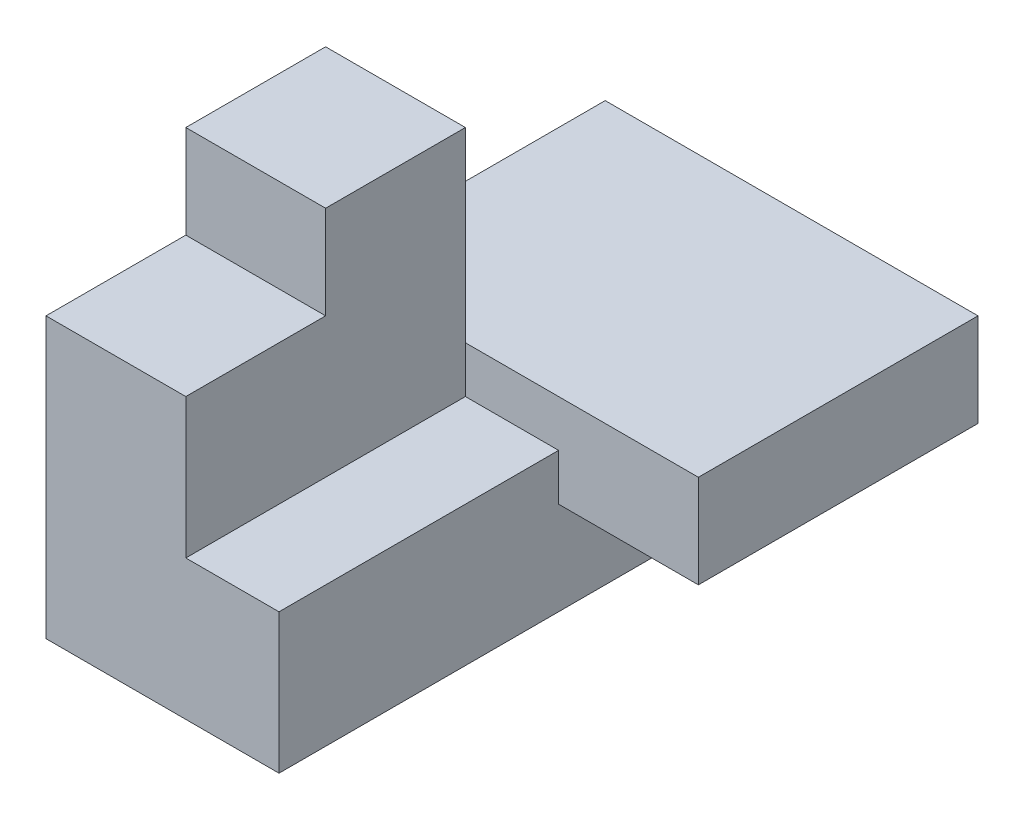
ISO-10303-21;
HEADER;
FILE_DESCRIPTION(('STEP AP214'),'2;1');
FILE_NAME('part.step','',(''),(''),'','','');
FILE_SCHEMA(('AUTOMOTIVE_DESIGN { 1 0 10303 214 1 1 1 1 }'));
ENDSEC;
DATA;
#1=APPLICATION_CONTEXT('core data for automotive mechanical design processes');
#2=APPLICATION_PROTOCOL_DEFINITION('international standard','automotive_design',2000,#1);
#3=PRODUCT_CONTEXT('',#1,'mechanical');
#4=PRODUCT('Part','Part','',(#3));
#5=PRODUCT_RELATED_PRODUCT_CATEGORY('part','',(#4));
#6=PRODUCT_DEFINITION_FORMATION('','',#4);
#7=PRODUCT_DEFINITION_CONTEXT('part definition',#1,'design');
#8=PRODUCT_DEFINITION('design','',#6,#7);
#9=PRODUCT_DEFINITION_SHAPE('','',#8);
#10=(LENGTH_UNIT() NAMED_UNIT(*) SI_UNIT(.MILLI.,.METRE.));
#11=(NAMED_UNIT(*) PLANE_ANGLE_UNIT() SI_UNIT($,.RADIAN.));
#12=(NAMED_UNIT(*) SI_UNIT($,.STERADIAN.) SOLID_ANGLE_UNIT());
#13=UNCERTAINTY_MEASURE_WITH_UNIT(LENGTH_MEASURE(1.E-05),#10,'distance_accuracy_value','');
#14=(GEOMETRIC_REPRESENTATION_CONTEXT(3) GLOBAL_UNCERTAINTY_ASSIGNED_CONTEXT((#13)) GLOBAL_UNIT_ASSIGNED_CONTEXT((#10,
#11,#12)) REPRESENTATION_CONTEXT('',''));
#15=CARTESIAN_POINT('',(0.,0.,0.));
#16=DIRECTION('',(0.,0.,1.));
#17=DIRECTION('',(1.,0.,0.));
#18=AXIS2_PLACEMENT_3D('',#15,#16,#17);
#19=CARTESIAN_POINT('',(0.,0.,30.));
#20=DIRECTION('',(0.,0.,-1.));
#21=DIRECTION('',(-1.,0.,0.));
#22=AXIS2_PLACEMENT_3D('',#19,#20,#21);
#23=PLANE('',#22);
#24=DIRECTION('',(-1.,0.,0.));
#25=VECTOR('',#24,1.);
#26=CARTESIAN_POINT('',(30.,15.,30.));
#27=LINE('',#26,#25);
#28=CARTESIAN_POINT('',(25.,15.,30.));
#29=VERTEX_POINT('',#28);
#30=CARTESIAN_POINT('',(15.,15.,30.));
#31=VERTEX_POINT('',#30);
#32=EDGE_CURVE('E138',#29,#31,#27,.T.);
#33=ORIENTED_EDGE('',*,*,#32,.F.);
#34=DIRECTION('',(0.,1.,0.));
#35=VECTOR('',#34,1.);
#36=CARTESIAN_POINT('',(25.,15.,30.));
#37=LINE('',#36,#35);
#38=CARTESIAN_POINT('',(25.,10.,30.));
#39=VERTEX_POINT('',#38);
#40=EDGE_CURVE('E122',#39,#29,#37,.T.);
#41=ORIENTED_EDGE('',*,*,#40,.F.);
#42=DIRECTION('',(1.,0.,0.));
#43=VECTOR('',#42,1.);
#44=CARTESIAN_POINT('',(25.,10.,30.));
#45=LINE('',#44,#43);
#46=CARTESIAN_POINT('',(40.,10.,30.));
#47=VERTEX_POINT('',#46);
#48=EDGE_CURVE('E175',#39,#47,#45,.T.);
#49=ORIENTED_EDGE('',*,*,#48,.T.);
#50=DIRECTION('',(0.,1.,0.));
#51=VECTOR('',#50,1.);
#52=CARTESIAN_POINT('',(40.,40.,30.));
#53=LINE('',#52,#51);
#54=CARTESIAN_POINT('',(40.,20.,30.));
#55=VERTEX_POINT('',#54);
#56=EDGE_CURVE('E194',#47,#55,#53,.T.);
#57=ORIENTED_EDGE('',*,*,#56,.T.);
#58=DIRECTION('',(-1.,0.,0.));
#59=VECTOR('',#58,1.);
#60=CARTESIAN_POINT('',(0.,20.,30.));
#61=LINE('',#60,#59);
#62=CARTESIAN_POINT('',(15.,20.,30.));
#63=VERTEX_POINT('',#62);
#64=EDGE_CURVE('E42',#55,#63,#61,.T.);
#65=ORIENTED_EDGE('',*,*,#64,.T.);
#66=DIRECTION('',(0.,1.,0.));
#67=VECTOR('',#66,1.);
#68=CARTESIAN_POINT('',(15.,15.,30.));
#69=LINE('',#68,#67);
#70=EDGE_CURVE('E144',#31,#63,#69,.T.);
#71=ORIENTED_EDGE('',*,*,#70,.F.);
#72=EDGE_LOOP('',(#33,#41,#49,#57,#65,#71));
#73=FACE_BOUND('',#72,.T.);
#74=ADVANCED_FACE('F33',(#73),#23,.F.);
#75=CARTESIAN_POINT('',(0.,0.,60.));
#76=DIRECTION('',(0.,1.,0.));
#77=DIRECTION('',(0.,0.,1.));
#78=AXIS2_PLACEMENT_3D('',#75,#76,#77);
#79=PLANE('',#78);
#80=DIRECTION('',(0.,0.,-1.));
#81=VECTOR('',#80,1.);
#82=CARTESIAN_POINT('',(25.,0.,0.));
#83=LINE('',#82,#81);
#84=CARTESIAN_POINT('',(25.,0.,60.));
#85=VERTEX_POINT('',#84);
#86=CARTESIAN_POINT('',(25.,0.,0.));
#87=VERTEX_POINT('',#86);
#88=EDGE_CURVE('E170',#85,#87,#83,.T.);
#89=ORIENTED_EDGE('',*,*,#88,.F.);
#90=DIRECTION('',(1.,0.,0.));
#91=VECTOR('',#90,1.);
#92=CARTESIAN_POINT('',(0.,0.,60.));
#93=LINE('',#92,#91);
#94=CARTESIAN_POINT('',(0.,0.,60.));
#95=VERTEX_POINT('',#94);
#96=EDGE_CURVE('E198',#95,#85,#93,.T.);
#97=ORIENTED_EDGE('',*,*,#96,.F.);
#98=DIRECTION('',(0.,0.,-1.));
#99=VECTOR('',#98,1.);
#100=CARTESIAN_POINT('',(0.,0.,60.));
#101=LINE('',#100,#99);
#102=CARTESIAN_POINT('',(0.,0.,0.));
#103=VERTEX_POINT('',#102);
#104=EDGE_CURVE('E208',#95,#103,#101,.T.);
#105=ORIENTED_EDGE('',*,*,#104,.T.);
#106=DIRECTION('',(1.,0.,0.));
#107=VECTOR('',#106,1.);
#108=CARTESIAN_POINT('',(0.,0.,0.));
#109=LINE('',#108,#107);
#110=EDGE_CURVE('E203',#103,#87,#109,.T.);
#111=ORIENTED_EDGE('',*,*,#110,.T.);
#112=EDGE_LOOP('',(#89,#97,#105,#111));
#113=FACE_BOUND('',#112,.T.);
#114=ADVANCED_FACE('F241',(#113),#79,.F.);
#115=CARTESIAN_POINT('',(0.,0.,60.));
#116=DIRECTION('',(1.,0.,0.));
#117=DIRECTION('',(0.,0.,-1.));
#118=AXIS2_PLACEMENT_3D('',#115,#116,#117);
#119=PLANE('',#118);
#120=DIRECTION('',(0.,0.,-1.));
#121=VECTOR('',#120,1.);
#122=CARTESIAN_POINT('',(0.,30.,60.));
#123=LINE('',#122,#121);
#124=CARTESIAN_POINT('',(0.,30.,60.));
#125=VERTEX_POINT('',#124);
#126=CARTESIAN_POINT('',(0.,30.,45.));
#127=VERTEX_POINT('',#126);
#128=EDGE_CURVE('E158',#125,#127,#123,.T.);
#129=ORIENTED_EDGE('',*,*,#128,.T.);
#130=DIRECTION('',(0.,1.,0.));
#131=VECTOR('',#130,1.);
#132=CARTESIAN_POINT('',(0.,0.,45.));
#133=LINE('',#132,#131);
#134=CARTESIAN_POINT('',(0.,40.,45.));
#135=VERTEX_POINT('',#134);
#136=EDGE_CURVE('E163',#127,#135,#133,.T.);
#137=ORIENTED_EDGE('',*,*,#136,.T.);
#138=DIRECTION('',(0.,0.,-1.));
#139=VECTOR('',#138,1.);
#140=CARTESIAN_POINT('',(0.,40.,60.));
#141=LINE('',#140,#139);
#142=CARTESIAN_POINT('',(0.,40.,30.));
#143=VERTEX_POINT('',#142);
#144=EDGE_CURVE('E201',#135,#143,#141,.T.);
#145=ORIENTED_EDGE('',*,*,#144,.T.);
#146=DIRECTION('',(0.,1.,0.));
#147=VECTOR('',#146,1.);
#148=CARTESIAN_POINT('',(0.,20.,30.));
#149=LINE('',#148,#147);
#150=CARTESIAN_POINT('',(0.,20.,30.));
#151=VERTEX_POINT('',#150);
#152=EDGE_CURVE('E189',#151,#143,#149,.T.);
#153=ORIENTED_EDGE('',*,*,#152,.F.);
#154=DIRECTION('',(0.,0.,1.));
#155=VECTOR('',#154,1.);
#156=CARTESIAN_POINT('',(0.,20.,0.));
#157=LINE('',#156,#155);
#158=CARTESIAN_POINT('',(0.,20.,0.));
#159=VERTEX_POINT('',#158);
#160=EDGE_CURVE('E184',#159,#151,#157,.T.);
#161=ORIENTED_EDGE('',*,*,#160,.F.);
#162=DIRECTION('',(0.,-1.,0.));
#163=VECTOR('',#162,1.);
#164=CARTESIAN_POINT('',(0.,0.,0.));
#165=LINE('',#164,#163);
#166=EDGE_CURVE('E196',#159,#103,#165,.T.);
#167=ORIENTED_EDGE('',*,*,#166,.T.);
#168=ORIENTED_EDGE('',*,*,#104,.F.);
#169=DIRECTION('',(0.,-1.,0.));
#170=VECTOR('',#169,1.);
#171=CARTESIAN_POINT('',(0.,0.,60.));
#172=LINE('',#171,#170);
#173=EDGE_CURVE('E48',#125,#95,#172,.T.);
#174=ORIENTED_EDGE('',*,*,#173,.F.);
#175=EDGE_LOOP('',(#129,#137,#145,#153,#161,#167,#168,#174));
#176=FACE_BOUND('',#175,.T.);
#177=ADVANCED_FACE('F35',(#176),#119,.F.);
#178=CARTESIAN_POINT('',(40.,0.,60.));
#179=DIRECTION('',(-1.,0.,0.));
#180=DIRECTION('',(0.,0.,1.));
#181=AXIS2_PLACEMENT_3D('',#178,#179,#180);
#182=PLANE('',#181);
#183=ORIENTED_EDGE('',*,*,#56,.F.);
#184=DIRECTION('',(0.,0.,1.));
#185=VECTOR('',#184,1.);
#186=CARTESIAN_POINT('',(40.,10.,0.));
#187=LINE('',#186,#185);
#188=CARTESIAN_POINT('',(40.,10.,0.));
#189=VERTEX_POINT('',#188);
#190=EDGE_CURVE('E166',#189,#47,#187,.T.);
#191=ORIENTED_EDGE('',*,*,#190,.F.);
#192=DIRECTION('',(0.,1.,0.));
#193=VECTOR('',#192,1.);
#194=CARTESIAN_POINT('',(40.,0.,0.));
#195=LINE('',#194,#193);
#196=CARTESIAN_POINT('',(40.,20.,0.));
#197=VERTEX_POINT('',#196);
#198=EDGE_CURVE('E199',#189,#197,#195,.T.);
#199=ORIENTED_EDGE('',*,*,#198,.T.);
#200=DIRECTION('',(0.,0.,-1.));
#201=VECTOR('',#200,1.);
#202=CARTESIAN_POINT('',(40.,20.,0.));
#203=LINE('',#202,#201);
#204=EDGE_CURVE('E179',#55,#197,#203,.T.);
#205=ORIENTED_EDGE('',*,*,#204,.F.);
#206=EDGE_LOOP('',(#183,#191,#199,#205));
#207=FACE_BOUND('',#206,.T.);
#208=ADVANCED_FACE('F259',(#207),#182,.F.);
#209=CARTESIAN_POINT('',(0.,40.,60.));
#210=DIRECTION('',(0.,-1.,0.));
#211=DIRECTION('',(0.,0.,-1.));
#212=AXIS2_PLACEMENT_3D('',#209,#210,#211);
#213=PLANE('',#212);
#214=DIRECTION('',(1.,0.,0.));
#215=VECTOR('',#214,1.);
#216=CARTESIAN_POINT('',(-5.,40.,45.));
#217=LINE('',#216,#215);
#218=CARTESIAN_POINT('',(15.,40.,45.));
#219=VERTEX_POINT('',#218);
#220=EDGE_CURVE('E155',#135,#219,#217,.T.);
#221=ORIENTED_EDGE('',*,*,#220,.T.);
#222=DIRECTION('',(0.,0.,1.));
#223=VECTOR('',#222,1.);
#224=CARTESIAN_POINT('',(15.,40.,60.));
#225=LINE('',#224,#223);
#226=CARTESIAN_POINT('',(15.,40.,30.));
#227=VERTEX_POINT('',#226);
#228=EDGE_CURVE('E221',#227,#219,#225,.T.);
#229=ORIENTED_EDGE('',*,*,#228,.F.);
#230=DIRECTION('',(1.,0.,0.));
#231=VECTOR('',#230,1.);
#232=CARTESIAN_POINT('',(40.,40.,30.));
#233=LINE('',#232,#231);
#234=EDGE_CURVE('E177',#143,#227,#233,.T.);
#235=ORIENTED_EDGE('',*,*,#234,.F.);
#236=ORIENTED_EDGE('',*,*,#144,.F.);
#237=EDGE_LOOP('',(#221,#229,#235,#236));
#238=FACE_BOUND('',#237,.T.);
#239=ADVANCED_FACE('F257',(#238),#213,.F.);
#240=CARTESIAN_POINT('',(0.,0.,60.));
#241=DIRECTION('',(0.,0.,-1.));
#242=DIRECTION('',(-1.,0.,0.));
#243=AXIS2_PLACEMENT_3D('',#240,#241,#242);
#244=PLANE('',#243);
#245=ORIENTED_EDGE('',*,*,#96,.T.);
#246=DIRECTION('',(0.,-1.,0.));
#247=VECTOR('',#246,1.);
#248=CARTESIAN_POINT('',(25.,15.,60.));
#249=LINE('',#248,#247);
#250=CARTESIAN_POINT('',(25.,15.,60.));
#251=VERTEX_POINT('',#250);
#252=EDGE_CURVE('E141',#251,#85,#249,.T.);
#253=ORIENTED_EDGE('',*,*,#252,.F.);
#254=DIRECTION('',(-1.,0.,0.));
#255=VECTOR('',#254,1.);
#256=CARTESIAN_POINT('',(30.,15.,60.));
#257=LINE('',#256,#255);
#258=CARTESIAN_POINT('',(15.,15.,60.));
#259=VERTEX_POINT('',#258);
#260=EDGE_CURVE('E140',#251,#259,#257,.T.);
#261=ORIENTED_EDGE('',*,*,#260,.T.);
#262=DIRECTION('',(0.,-1.,0.));
#263=VECTOR('',#262,1.);
#264=CARTESIAN_POINT('',(15.,15.,60.));
#265=LINE('',#264,#263);
#266=CARTESIAN_POINT('',(15.,30.,60.));
#267=VERTEX_POINT('',#266);
#268=EDGE_CURVE('E248',#267,#259,#265,.T.);
#269=ORIENTED_EDGE('',*,*,#268,.F.);
#270=DIRECTION('',(1.,0.,0.));
#271=VECTOR('',#270,1.);
#272=CARTESIAN_POINT('',(-5.,30.,60.));
#273=LINE('',#272,#271);
#274=EDGE_CURVE('E146',#125,#267,#273,.T.);
#275=ORIENTED_EDGE('',*,*,#274,.F.);
#276=ORIENTED_EDGE('',*,*,#173,.T.);
#277=EDGE_LOOP('',(#245,#253,#261,#269,#275,#276));
#278=FACE_BOUND('',#277,.T.);
#279=ADVANCED_FACE('F247',(#278),#244,.F.);
#280=CARTESIAN_POINT('',(0.,0.,0.));
#281=DIRECTION('',(0.,0.,-1.));
#282=DIRECTION('',(-1.,0.,0.));
#283=AXIS2_PLACEMENT_3D('',#280,#281,#282);
#284=PLANE('',#283);
#285=DIRECTION('',(1.,0.,0.));
#286=VECTOR('',#285,1.);
#287=CARTESIAN_POINT('',(25.,10.,0.));
#288=LINE('',#287,#286);
#289=CARTESIAN_POINT('',(25.,10.,0.));
#290=VERTEX_POINT('',#289);
#291=EDGE_CURVE('E172',#290,#189,#288,.T.);
#292=ORIENTED_EDGE('',*,*,#291,.F.);
#293=DIRECTION('',(0.,1.,0.));
#294=VECTOR('',#293,1.);
#295=CARTESIAN_POINT('',(25.,0.,0.));
#296=LINE('',#295,#294);
#297=EDGE_CURVE('E167',#87,#290,#296,.T.);
#298=ORIENTED_EDGE('',*,*,#297,.F.);
#299=ORIENTED_EDGE('',*,*,#110,.F.);
#300=ORIENTED_EDGE('',*,*,#166,.F.);
#301=DIRECTION('',(-1.,0.,0.));
#302=VECTOR('',#301,1.);
#303=CARTESIAN_POINT('',(40.,20.,0.));
#304=LINE('',#303,#302);
#305=EDGE_CURVE('E182',#197,#159,#304,.T.);
#306=ORIENTED_EDGE('',*,*,#305,.F.);
#307=ORIENTED_EDGE('',*,*,#198,.F.);
#308=EDGE_LOOP('',(#292,#298,#299,#300,#306,#307));
#309=FACE_BOUND('',#308,.T.);
#310=ADVANCED_FACE('F237',(#309),#284,.T.);
#311=CARTESIAN_POINT('',(40.,20.,30.));
#312=DIRECTION('',(0.,0.,1.));
#313=DIRECTION('',(1.,0.,0.));
#314=AXIS2_PLACEMENT_3D('',#311,#312,#313);
#315=PLANE('',#314);
#316=ORIENTED_EDGE('',*,*,#234,.T.);
#317=EDGE_CURVE('E217',#63,#227,#69,.T.);
#318=ORIENTED_EDGE('',*,*,#317,.F.);
#319=DIRECTION('',(1.,0.,0.));
#320=VECTOR('',#319,1.);
#321=CARTESIAN_POINT('',(40.,20.,30.));
#322=LINE('',#321,#320);
#323=EDGE_CURVE('E186',#151,#63,#322,.T.);
#324=ORIENTED_EDGE('',*,*,#323,.F.);
#325=ORIENTED_EDGE('',*,*,#152,.T.);
#326=EDGE_LOOP('',(#316,#318,#324,#325));
#327=FACE_BOUND('',#326,.T.);
#328=ADVANCED_FACE('F225',(#327),#315,.F.);
#329=CARTESIAN_POINT('',(0.,20.,0.));
#330=DIRECTION('',(0.,-1.,0.));
#331=DIRECTION('',(0.,0.,-1.));
#332=AXIS2_PLACEMENT_3D('',#329,#330,#331);
#333=PLANE('',#332);
#334=ORIENTED_EDGE('',*,*,#204,.T.);
#335=ORIENTED_EDGE('',*,*,#305,.T.);
#336=ORIENTED_EDGE('',*,*,#160,.T.);
#337=ORIENTED_EDGE('',*,*,#323,.T.);
#338=ORIENTED_EDGE('',*,*,#64,.F.);
#339=EDGE_LOOP('',(#334,#335,#336,#337,#338));
#340=FACE_BOUND('',#339,.T.);
#341=ADVANCED_FACE('F228',(#340),#333,.F.);
#342=CARTESIAN_POINT('',(25.,10.,0.));
#343=DIRECTION('',(0.,1.,0.));
#344=DIRECTION('',(0.,0.,1.));
#345=AXIS2_PLACEMENT_3D('',#342,#343,#344);
#346=PLANE('',#345);
#347=ORIENTED_EDGE('',*,*,#190,.T.);
#348=ORIENTED_EDGE('',*,*,#48,.F.);
#349=DIRECTION('',(0.,0.,1.));
#350=VECTOR('',#349,1.);
#351=CARTESIAN_POINT('',(25.,10.,0.));
#352=LINE('',#351,#350);
#353=EDGE_CURVE('E129',#290,#39,#352,.T.);
#354=ORIENTED_EDGE('',*,*,#353,.F.);
#355=ORIENTED_EDGE('',*,*,#291,.T.);
#356=EDGE_LOOP('',(#347,#348,#354,#355));
#357=FACE_BOUND('',#356,.T.);
#358=ADVANCED_FACE('F283',(#357),#346,.F.);
#359=CARTESIAN_POINT('',(25.,0.,0.));
#360=DIRECTION('',(1.,0.,0.));
#361=DIRECTION('',(0.,0.,-1.));
#362=AXIS2_PLACEMENT_3D('',#359,#360,#361);
#363=PLANE('',#362);
#364=ORIENTED_EDGE('',*,*,#297,.T.);
#365=ORIENTED_EDGE('',*,*,#353,.T.);
#366=ORIENTED_EDGE('',*,*,#40,.T.);
#367=DIRECTION('',(0.,0.,1.));
#368=VECTOR('',#367,1.);
#369=CARTESIAN_POINT('',(25.,15.,30.));
#370=LINE('',#369,#368);
#371=EDGE_CURVE('E127',#29,#251,#370,.T.);
#372=ORIENTED_EDGE('',*,*,#371,.T.);
#373=ORIENTED_EDGE('',*,*,#252,.T.);
#374=ORIENTED_EDGE('',*,*,#88,.T.);
#375=EDGE_LOOP('',(#364,#365,#366,#372,#373,#374));
#376=FACE_BOUND('',#375,.T.);
#377=ADVANCED_FACE('F125',(#376),#363,.T.);
#378=CARTESIAN_POINT('',(-5.,40.,45.));
#379=DIRECTION('',(0.,0.,-1.));
#380=DIRECTION('',(-1.,0.,0.));
#381=AXIS2_PLACEMENT_3D('',#378,#379,#380);
#382=PLANE('',#381);
#383=DIRECTION('',(1.,0.,0.));
#384=VECTOR('',#383,1.);
#385=CARTESIAN_POINT('',(-5.,30.,45.));
#386=LINE('',#385,#384);
#387=CARTESIAN_POINT('',(15.,30.,45.));
#388=VERTEX_POINT('',#387);
#389=EDGE_CURVE('E149',#127,#388,#386,.T.);
#390=ORIENTED_EDGE('',*,*,#389,.T.);
#391=DIRECTION('',(0.,1.,0.));
#392=VECTOR('',#391,1.);
#393=CARTESIAN_POINT('',(15.,40.,45.));
#394=LINE('',#393,#392);
#395=EDGE_CURVE('E151',#388,#219,#394,.T.);
#396=ORIENTED_EDGE('',*,*,#395,.T.);
#397=ORIENTED_EDGE('',*,*,#220,.F.);
#398=ORIENTED_EDGE('',*,*,#136,.F.);
#399=EDGE_LOOP('',(#390,#396,#397,#398));
#400=FACE_BOUND('',#399,.T.);
#401=ADVANCED_FACE('F255',(#400),#382,.F.);
#402=CARTESIAN_POINT('',(-5.,30.,60.));
#403=DIRECTION('',(0.,-1.,0.));
#404=DIRECTION('',(0.,0.,-1.));
#405=AXIS2_PLACEMENT_3D('',#402,#403,#404);
#406=PLANE('',#405);
#407=ORIENTED_EDGE('',*,*,#274,.T.);
#408=DIRECTION('',(0.,0.,-1.));
#409=VECTOR('',#408,1.);
#410=CARTESIAN_POINT('',(15.,30.,60.));
#411=LINE('',#410,#409);
#412=EDGE_CURVE('E11',#267,#388,#411,.T.);
#413=ORIENTED_EDGE('',*,*,#412,.T.);
#414=ORIENTED_EDGE('',*,*,#389,.F.);
#415=ORIENTED_EDGE('',*,*,#128,.F.);
#416=EDGE_LOOP('',(#407,#413,#414,#415));
#417=FACE_BOUND('',#416,.T.);
#418=ADVANCED_FACE('F245',(#417),#406,.F.);
#419=CARTESIAN_POINT('',(30.,15.,60.));
#420=DIRECTION('',(0.,-1.,0.));
#421=DIRECTION('',(0.,0.,-1.));
#422=AXIS2_PLACEMENT_3D('',#419,#420,#421);
#423=PLANE('',#422);
#424=ORIENTED_EDGE('',*,*,#260,.F.);
#425=ORIENTED_EDGE('',*,*,#371,.F.);
#426=ORIENTED_EDGE('',*,*,#32,.T.);
#427=DIRECTION('',(0.,0.,-1.));
#428=VECTOR('',#427,1.);
#429=CARTESIAN_POINT('',(15.,15.,60.));
#430=LINE('',#429,#428);
#431=EDGE_CURVE('E220',#259,#31,#430,.T.);
#432=ORIENTED_EDGE('',*,*,#431,.F.);
#433=EDGE_LOOP('',(#424,#425,#426,#432));
#434=FACE_BOUND('',#433,.T.);
#435=ADVANCED_FACE('F136',(#434),#423,.F.);
#436=CARTESIAN_POINT('',(15.,0.,0.));
#437=DIRECTION('',(-1.,0.,0.));
#438=DIRECTION('',(0.,0.,1.));
#439=AXIS2_PLACEMENT_3D('',#436,#437,#438);
#440=PLANE('',#439);
#441=ORIENTED_EDGE('',*,*,#412,.F.);
#442=ORIENTED_EDGE('',*,*,#268,.T.);
#443=ORIENTED_EDGE('',*,*,#431,.T.);
#444=ORIENTED_EDGE('',*,*,#70,.T.);
#445=ORIENTED_EDGE('',*,*,#317,.T.);
#446=ORIENTED_EDGE('',*,*,#228,.T.);
#447=ORIENTED_EDGE('',*,*,#395,.F.);
#448=EDGE_LOOP('',(#441,#442,#443,#444,#445,#446,#447));
#449=FACE_BOUND('',#448,.T.);
#450=ADVANCED_FACE('F216',(#449),#440,.F.);
#451=CLOSED_SHELL('',(#74,#114,#177,#208,#239,#279,#310,#328,#341,#358,#377,#401,#418,#435,#450));
#452=MANIFOLD_SOLID_BREP('B2',#451);
#453=ADVANCED_BREP_SHAPE_REPRESENTATION('',(#18,#452),#14);
#454=SHAPE_DEFINITION_REPRESENTATION(#9,#453);
ENDSEC;
END-ISO-10303-21;
